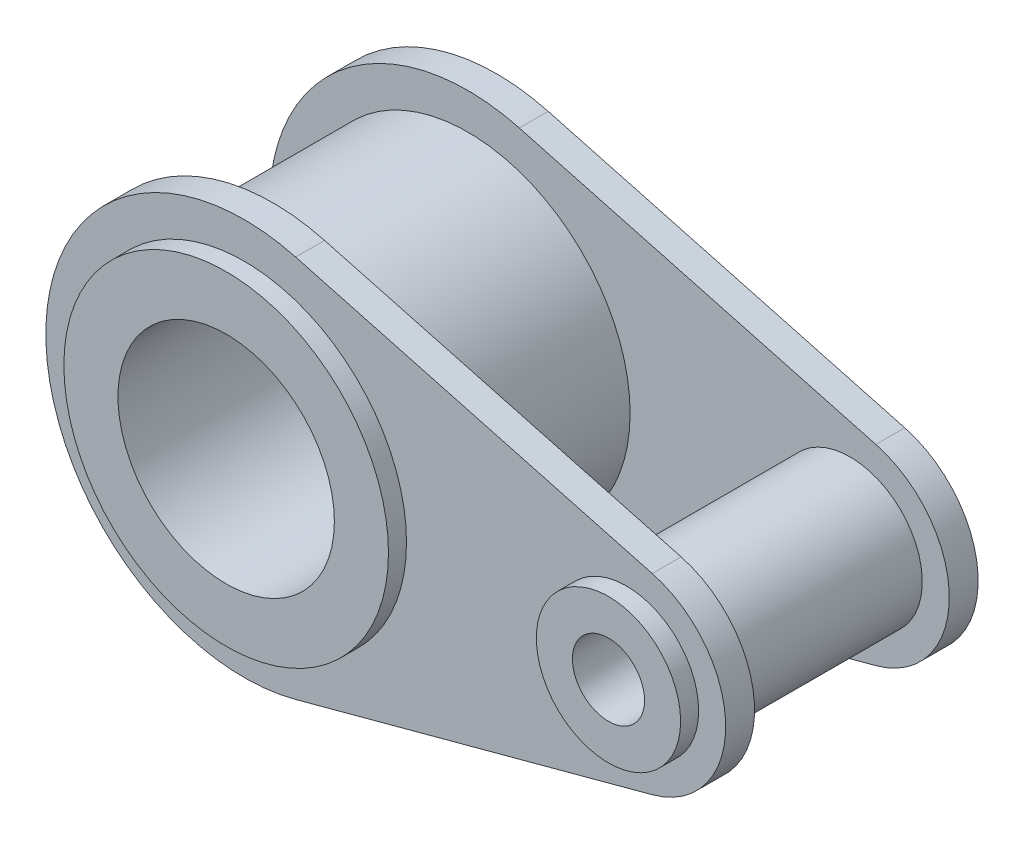
ISO-10303-21;
HEADER;
FILE_DESCRIPTION(('STEP AP214'),'2;1');
FILE_NAME('part.step','',(''),(''),'','','');
FILE_SCHEMA(('AUTOMOTIVE_DESIGN { 1 0 10303 214 1 1 1 1 }'));
ENDSEC;
DATA;
#1=APPLICATION_CONTEXT('core data for automotive mechanical design processes');
#2=APPLICATION_PROTOCOL_DEFINITION('international standard','automotive_design',2000,#1);
#3=PRODUCT_CONTEXT('',#1,'mechanical');
#4=PRODUCT('Part','Part','',(#3));
#5=PRODUCT_RELATED_PRODUCT_CATEGORY('part','',(#4));
#6=PRODUCT_DEFINITION_FORMATION('','',#4);
#7=PRODUCT_DEFINITION_CONTEXT('part definition',#1,'design');
#8=PRODUCT_DEFINITION('design','',#6,#7);
#9=PRODUCT_DEFINITION_SHAPE('','',#8);
#10=(LENGTH_UNIT() NAMED_UNIT(*) SI_UNIT(.MILLI.,.METRE.));
#11=(NAMED_UNIT(*) PLANE_ANGLE_UNIT() SI_UNIT($,.RADIAN.));
#12=(NAMED_UNIT(*) SI_UNIT($,.STERADIAN.) SOLID_ANGLE_UNIT());
#13=UNCERTAINTY_MEASURE_WITH_UNIT(LENGTH_MEASURE(1.E-05),#10,'distance_accuracy_value','');
#14=(GEOMETRIC_REPRESENTATION_CONTEXT(3) GLOBAL_UNCERTAINTY_ASSIGNED_CONTEXT((#13)) GLOBAL_UNIT_ASSIGNED_CONTEXT((#10,
#11,#12)) REPRESENTATION_CONTEXT('',''));
#15=CARTESIAN_POINT('',(0.,0.,0.));
#16=DIRECTION('',(0.,0.,1.));
#17=DIRECTION('',(1.,0.,0.));
#18=AXIS2_PLACEMENT_3D('',#15,#16,#17);
#19=CARTESIAN_POINT('',(0.,0.,40.));
#20=DIRECTION('',(0.,0.,-1.));
#21=DIRECTION('',(-1.,0.,0.));
#22=AXIS2_PLACEMENT_3D('',#19,#20,#21);
#23=CYLINDRICAL_SURFACE('',#22,45.);
#24=CARTESIAN_POINT('',(0.,0.,27.));
#25=DIRECTION('',(0.,0.,1.));
#26=DIRECTION('',(1.,0.,0.));
#27=AXIS2_PLACEMENT_3D('',#24,#25,#26);
#28=CIRCLE('',#27,45.);
#29=CARTESIAN_POINT('',(45.,0.,27.));
#30=VERTEX_POINT('',#29);
#31=EDGE_CURVE('E255',#30,#30,#28,.T.);
#32=ORIENTED_EDGE('',*,*,#31,.F.);
#33=EDGE_LOOP('',(#32));
#34=FACE_BOUND('',#33,.T.);
#35=CARTESIAN_POINT('',(0.,0.,-27.));
#36=DIRECTION('',(0.,0.,-1.));
#37=DIRECTION('',(-1.,0.,0.));
#38=AXIS2_PLACEMENT_3D('',#35,#36,#37);
#39=CIRCLE('',#38,45.);
#40=CARTESIAN_POINT('',(-45.,0.,-27.));
#41=VERTEX_POINT('',#40);
#42=EDGE_CURVE('E11',#41,#41,#39,.T.);
#43=ORIENTED_EDGE('',*,*,#42,.F.);
#44=EDGE_LOOP('',(#43));
#45=FACE_BOUND('',#44,.T.);
#46=ADVANCED_FACE('F43',(#34,#45),#23,.T.);
#47=CARTESIAN_POINT('',(106.,0.,40.));
#48=DIRECTION('',(0.,0.,-1.));
#49=DIRECTION('',(-1.,0.,0.));
#50=AXIS2_PLACEMENT_3D('',#47,#48,#49);
#51=CYLINDRICAL_SURFACE('',#50,20.);
#52=CARTESIAN_POINT('',(106.,0.,27.));
#53=DIRECTION('',(0.,0.,1.));
#54=DIRECTION('',(1.,0.,0.));
#55=AXIS2_PLACEMENT_3D('',#52,#53,#54);
#56=CIRCLE('',#55,20.);
#57=CARTESIAN_POINT('',(126.,0.,27.));
#58=VERTEX_POINT('',#57);
#59=EDGE_CURVE('E191',#58,#58,#56,.F.);
#60=ORIENTED_EDGE('',*,*,#59,.T.);
#61=EDGE_LOOP('',(#60));
#62=FACE_BOUND('',#61,.T.);
#63=CARTESIAN_POINT('',(106.,0.,-27.));
#64=DIRECTION('',(0.,0.,-1.));
#65=DIRECTION('',(-1.,0.,0.));
#66=AXIS2_PLACEMENT_3D('',#63,#64,#65);
#67=CIRCLE('',#66,20.);
#68=CARTESIAN_POINT('',(86.,0.,-27.));
#69=VERTEX_POINT('',#68);
#70=EDGE_CURVE('E53',#69,#69,#67,.T.);
#71=ORIENTED_EDGE('',*,*,#70,.F.);
#72=EDGE_LOOP('',(#71));
#73=FACE_BOUND('',#72,.T.);
#74=ADVANCED_FACE('F270',(#62,#73),#51,.T.);
#75=CARTESIAN_POINT('',(0.,0.,-35.));
#76=DIRECTION('',(0.,0.,1.));
#77=DIRECTION('',(1.,0.,0.));
#78=AXIS2_PLACEMENT_3D('',#75,#76,#77);
#79=CIRCLE('',#78,45.);
#80=CARTESIAN_POINT('',(45.,0.,-35.));
#81=VERTEX_POINT('',#80);
#82=EDGE_CURVE('E162',#81,#81,#79,.T.);
#83=ORIENTED_EDGE('',*,*,#82,.F.);
#84=EDGE_LOOP('',(#83));
#85=FACE_BOUND('',#84,.T.);
#86=CARTESIAN_POINT('',(0.,0.,-40.));
#87=DIRECTION('',(0.,0.,1.));
#88=DIRECTION('',(1.,0.,0.));
#89=AXIS2_PLACEMENT_3D('',#86,#87,#88);
#90=CIRCLE('',#89,45.);
#91=CARTESIAN_POINT('',(45.,0.,-40.));
#92=VERTEX_POINT('',#91);
#93=EDGE_CURVE('E238',#92,#92,#90,.T.);
#94=ORIENTED_EDGE('',*,*,#93,.T.);
#95=EDGE_LOOP('',(#94));
#96=FACE_BOUND('',#95,.T.);
#97=ADVANCED_FACE('F272',(#85,#96),#23,.T.);
#98=CARTESIAN_POINT('',(0.,0.,35.));
#99=DIRECTION('',(0.,0.,1.));
#100=DIRECTION('',(1.,0.,0.));
#101=AXIS2_PLACEMENT_3D('',#98,#99,#100);
#102=CIRCLE('',#101,45.);
#103=CARTESIAN_POINT('',(45.,0.,35.));
#104=VERTEX_POINT('',#103);
#105=EDGE_CURVE('E218',#104,#104,#102,.T.);
#106=ORIENTED_EDGE('',*,*,#105,.T.);
#107=EDGE_LOOP('',(#106));
#108=FACE_BOUND('',#107,.T.);
#109=CARTESIAN_POINT('',(0.,0.,40.));
#110=DIRECTION('',(0.,0.,1.));
#111=DIRECTION('',(1.,0.,0.));
#112=AXIS2_PLACEMENT_3D('',#109,#110,#111);
#113=CIRCLE('',#112,45.);
#114=CARTESIAN_POINT('',(45.,0.,40.));
#115=VERTEX_POINT('',#114);
#116=EDGE_CURVE('E246',#115,#115,#113,.T.);
#117=ORIENTED_EDGE('',*,*,#116,.F.);
#118=EDGE_LOOP('',(#117));
#119=FACE_BOUND('',#118,.T.);
#120=ADVANCED_FACE('F45',(#108,#119),#23,.T.);
#121=CARTESIAN_POINT('',(0.,0.,40.));
#122=DIRECTION('',(0.,0.,-1.));
#123=DIRECTION('',(-1.,0.,0.));
#124=AXIS2_PLACEMENT_3D('',#121,#122,#123);
#125=CYLINDRICAL_SURFACE('',#124,30.);
#126=CARTESIAN_POINT('',(0.,0.,40.));
#127=DIRECTION('',(0.,0.,1.));
#128=DIRECTION('',(1.,0.,0.));
#129=AXIS2_PLACEMENT_3D('',#126,#127,#128);
#130=CIRCLE('',#129,30.);
#131=CARTESIAN_POINT('',(30.,0.,40.));
#132=VERTEX_POINT('',#131);
#133=EDGE_CURVE('E250',#132,#132,#130,.T.);
#134=ORIENTED_EDGE('',*,*,#133,.T.);
#135=EDGE_LOOP('',(#134));
#136=FACE_BOUND('',#135,.T.);
#137=CARTESIAN_POINT('',(0.,0.,-40.));
#138=DIRECTION('',(0.,0.,1.));
#139=DIRECTION('',(1.,0.,0.));
#140=AXIS2_PLACEMENT_3D('',#137,#138,#139);
#141=CIRCLE('',#140,30.);
#142=CARTESIAN_POINT('',(30.,0.,-40.));
#143=VERTEX_POINT('',#142);
#144=EDGE_CURVE('E251',#143,#143,#141,.T.);
#145=ORIENTED_EDGE('',*,*,#144,.F.);
#146=EDGE_LOOP('',(#145));
#147=FACE_BOUND('',#146,.T.);
#148=ADVANCED_FACE('F338',(#136,#147),#125,.F.);
#149=CARTESIAN_POINT('',(0.,0.,40.));
#150=DIRECTION('',(0.,0.,1.));
#151=DIRECTION('',(1.,0.,0.));
#152=AXIS2_PLACEMENT_3D('',#149,#150,#151);
#153=PLANE('',#152);
#154=ORIENTED_EDGE('',*,*,#116,.T.);
#155=EDGE_LOOP('',(#154));
#156=FACE_BOUND('',#155,.T.);
#157=ORIENTED_EDGE('',*,*,#133,.F.);
#158=EDGE_LOOP('',(#157));
#159=FACE_BOUND('',#158,.T.);
#160=ADVANCED_FACE('F335',(#156,#159),#153,.T.);
#161=CARTESIAN_POINT('',(0.,0.,-40.));
#162=DIRECTION('',(0.,0.,1.));
#163=DIRECTION('',(1.,0.,0.));
#164=AXIS2_PLACEMENT_3D('',#161,#162,#163);
#165=PLANE('',#164);
#166=ORIENTED_EDGE('',*,*,#93,.F.);
#167=EDGE_LOOP('',(#166));
#168=FACE_BOUND('',#167,.T.);
#169=ORIENTED_EDGE('',*,*,#144,.T.);
#170=EDGE_LOOP('',(#169));
#171=FACE_BOUND('',#170,.T.);
#172=ADVANCED_FACE('F334',(#168,#171),#165,.F.);
#173=CARTESIAN_POINT('',(14.2688679245283,-53.1168467451934,27.));
#174=DIRECTION('',(0.259433962264151,-0.965760849912608,0.));
#175=DIRECTION('',(0.965760849912608,0.259433962264151,0.));
#176=AXIS2_PLACEMENT_3D('',#173,#174,#175);
#177=PLANE('',#176);
#178=DIRECTION('',(0.965760849912608,0.259433962264151,0.));
#179=VECTOR('',#178,1.);
#180=CARTESIAN_POINT('',(14.2688679245283,-53.1168467451934,35.));
#181=LINE('',#180,#179);
#182=CARTESIAN_POINT('',(14.2688679245283,-53.1168467451934,35.));
#183=VERTEX_POINT('',#182);
#184=CARTESIAN_POINT('',(113.134433962264,-26.5584233725967,35.));
#185=VERTEX_POINT('',#184);
#186=EDGE_CURVE('E222',#183,#185,#181,.T.);
#187=ORIENTED_EDGE('',*,*,#186,.F.);
#188=DIRECTION('',(0.,0.,1.));
#189=VECTOR('',#188,1.);
#190=CARTESIAN_POINT('',(14.2688679245283,-53.1168467451934,27.));
#191=LINE('',#190,#189);
#192=CARTESIAN_POINT('',(14.2688679245283,-53.1168467451934,27.));
#193=VERTEX_POINT('',#192);
#194=EDGE_CURVE('E61',#193,#183,#191,.T.);
#195=ORIENTED_EDGE('',*,*,#194,.F.);
#196=DIRECTION('',(0.965760849912608,0.259433962264151,0.));
#197=VECTOR('',#196,1.);
#198=CARTESIAN_POINT('',(14.2688679245283,-53.1168467451934,27.));
#199=LINE('',#198,#197);
#200=CARTESIAN_POINT('',(113.134433962264,-26.5584233725967,27.));
#201=VERTEX_POINT('',#200);
#202=EDGE_CURVE('E202',#193,#201,#199,.T.);
#203=ORIENTED_EDGE('',*,*,#202,.T.);
#204=DIRECTION('',(0.,0.,1.));
#205=VECTOR('',#204,1.);
#206=CARTESIAN_POINT('',(113.134433962264,-26.5584233725967,27.));
#207=LINE('',#206,#205);
#208=EDGE_CURVE('E90',#201,#185,#207,.T.);
#209=ORIENTED_EDGE('',*,*,#208,.T.);
#210=EDGE_LOOP('',(#187,#195,#203,#209));
#211=FACE_BOUND('',#210,.T.);
#212=ADVANCED_FACE('F311',(#211),#177,.T.);
#213=CARTESIAN_POINT('',(0.,0.,27.));
#214=DIRECTION('',(0.,0.,1.));
#215=DIRECTION('',(1.,0.,0.));
#216=AXIS2_PLACEMENT_3D('',#213,#214,#215);
#217=CYLINDRICAL_SURFACE('',#216,55.);
#218=CARTESIAN_POINT('',(0.,0.,35.));
#219=DIRECTION('',(0.,0.,1.));
#220=DIRECTION('',(1.,0.,0.));
#221=AXIS2_PLACEMENT_3D('',#218,#219,#220);
#222=CIRCLE('',#221,55.);
#223=CARTESIAN_POINT('',(14.2688679245283,53.1168467451934,35.));
#224=VERTEX_POINT('',#223);
#225=EDGE_CURVE('E206',#224,#183,#222,.T.);
#226=ORIENTED_EDGE('',*,*,#225,.F.);
#227=DIRECTION('',(0.,0.,1.));
#228=VECTOR('',#227,1.);
#229=CARTESIAN_POINT('',(14.2688679245283,53.1168467451934,27.));
#230=LINE('',#229,#228);
#231=CARTESIAN_POINT('',(14.2688679245283,53.1168467451934,27.));
#232=VERTEX_POINT('',#231);
#233=EDGE_CURVE('E79',#232,#224,#230,.T.);
#234=ORIENTED_EDGE('',*,*,#233,.F.);
#235=CARTESIAN_POINT('',(0.,0.,27.));
#236=DIRECTION('',(0.,0.,1.));
#237=DIRECTION('',(1.,0.,0.));
#238=AXIS2_PLACEMENT_3D('',#235,#236,#237);
#239=CIRCLE('',#238,55.);
#240=EDGE_CURVE('E212',#232,#193,#239,.T.);
#241=ORIENTED_EDGE('',*,*,#240,.T.);
#242=ORIENTED_EDGE('',*,*,#194,.T.);
#243=EDGE_LOOP('',(#226,#234,#241,#242));
#244=FACE_BOUND('',#243,.T.);
#245=ADVANCED_FACE('F315',(#244),#217,.T.);
#246=CARTESIAN_POINT('',(14.2688679245283,53.1168467451934,27.));
#247=DIRECTION('',(-0.259433962264151,-0.965760849912608,0.));
#248=DIRECTION('',(0.965760849912608,-0.259433962264151,0.));
#249=AXIS2_PLACEMENT_3D('',#246,#247,#248);
#250=PLANE('',#249);
#251=DIRECTION('',(0.965760849912608,-0.259433962264151,0.));
#252=VECTOR('',#251,1.);
#253=CARTESIAN_POINT('',(14.2688679245283,53.1168467451934,35.));
#254=LINE('',#253,#252);
#255=CARTESIAN_POINT('',(113.134433962264,26.5584233725967,35.));
#256=VERTEX_POINT('',#255);
#257=EDGE_CURVE('E230',#224,#256,#254,.T.);
#258=ORIENTED_EDGE('',*,*,#257,.T.);
#259=DIRECTION('',(0.,0.,1.));
#260=VECTOR('',#259,1.);
#261=CARTESIAN_POINT('',(113.134433962264,26.5584233725967,27.));
#262=LINE('',#261,#260);
#263=CARTESIAN_POINT('',(113.134433962264,26.5584233725967,27.));
#264=VERTEX_POINT('',#263);
#265=EDGE_CURVE('E241',#264,#256,#262,.T.);
#266=ORIENTED_EDGE('',*,*,#265,.F.);
#267=DIRECTION('',(0.965760849912608,-0.259433962264151,0.));
#268=VECTOR('',#267,1.);
#269=CARTESIAN_POINT('',(14.2688679245283,53.1168467451934,27.));
#270=LINE('',#269,#268);
#271=EDGE_CURVE('E209',#232,#264,#270,.T.);
#272=ORIENTED_EDGE('',*,*,#271,.F.);
#273=ORIENTED_EDGE('',*,*,#233,.T.);
#274=EDGE_LOOP('',(#258,#266,#272,#273));
#275=FACE_BOUND('',#274,.T.);
#276=ADVANCED_FACE('F314',(#275),#250,.F.);
#277=CARTESIAN_POINT('',(106.,0.,27.));
#278=DIRECTION('',(0.,0.,1.));
#279=DIRECTION('',(1.,0.,0.));
#280=AXIS2_PLACEMENT_3D('',#277,#278,#279);
#281=CYLINDRICAL_SURFACE('',#280,27.5);
#282=CARTESIAN_POINT('',(106.,0.,35.));
#283=DIRECTION('',(0.,0.,1.));
#284=DIRECTION('',(1.,0.,0.));
#285=AXIS2_PLACEMENT_3D('',#282,#283,#284);
#286=CIRCLE('',#285,27.5);
#287=EDGE_CURVE('E226',#185,#256,#286,.T.);
#288=ORIENTED_EDGE('',*,*,#287,.F.);
#289=ORIENTED_EDGE('',*,*,#208,.F.);
#290=CARTESIAN_POINT('',(106.,0.,27.));
#291=DIRECTION('',(0.,0.,1.));
#292=DIRECTION('',(1.,0.,0.));
#293=AXIS2_PLACEMENT_3D('',#290,#291,#292);
#294=CIRCLE('',#293,27.5);
#295=EDGE_CURVE('E205',#201,#264,#294,.T.);
#296=ORIENTED_EDGE('',*,*,#295,.T.);
#297=ORIENTED_EDGE('',*,*,#265,.T.);
#298=EDGE_LOOP('',(#288,#289,#296,#297));
#299=FACE_BOUND('',#298,.T.);
#300=ADVANCED_FACE('F312',(#299),#281,.T.);
#301=CARTESIAN_POINT('',(0.,0.,27.));
#302=DIRECTION('',(0.,0.,1.));
#303=DIRECTION('',(1.,0.,0.));
#304=AXIS2_PLACEMENT_3D('',#301,#302,#303);
#305=PLANE('',#304);
#306=ORIENTED_EDGE('',*,*,#59,.F.);
#307=EDGE_LOOP('',(#306));
#308=FACE_BOUND('',#307,.T.);
#309=ORIENTED_EDGE('',*,*,#31,.T.);
#310=EDGE_LOOP('',(#309));
#311=FACE_BOUND('',#310,.T.);
#312=ORIENTED_EDGE('',*,*,#202,.F.);
#313=ORIENTED_EDGE('',*,*,#240,.F.);
#314=ORIENTED_EDGE('',*,*,#271,.T.);
#315=ORIENTED_EDGE('',*,*,#295,.F.);
#316=EDGE_LOOP('',(#312,#313,#314,#315));
#317=FACE_BOUND('',#316,.T.);
#318=ADVANCED_FACE('F307',(#308,#311,#317),#305,.F.);
#319=CARTESIAN_POINT('',(0.,0.,35.));
#320=DIRECTION('',(0.,0.,1.));
#321=DIRECTION('',(1.,0.,0.));
#322=AXIS2_PLACEMENT_3D('',#319,#320,#321);
#323=PLANE('',#322);
#324=CARTESIAN_POINT('',(106.,0.,35.));
#325=DIRECTION('',(0.,0.,1.));
#326=DIRECTION('',(1.,0.,0.));
#327=AXIS2_PLACEMENT_3D('',#324,#325,#326);
#328=CIRCLE('',#327,20.);
#329=CARTESIAN_POINT('',(126.,0.,35.));
#330=VERTEX_POINT('',#329);
#331=EDGE_CURVE('E201',#330,#330,#328,.T.);
#332=ORIENTED_EDGE('',*,*,#331,.F.);
#333=EDGE_LOOP('',(#332));
#334=FACE_BOUND('',#333,.T.);
#335=ORIENTED_EDGE('',*,*,#105,.F.);
#336=EDGE_LOOP('',(#335));
#337=FACE_BOUND('',#336,.T.);
#338=ORIENTED_EDGE('',*,*,#186,.T.);
#339=ORIENTED_EDGE('',*,*,#287,.T.);
#340=ORIENTED_EDGE('',*,*,#257,.F.);
#341=ORIENTED_EDGE('',*,*,#225,.T.);
#342=EDGE_LOOP('',(#338,#339,#340,#341));
#343=FACE_BOUND('',#342,.T.);
#344=ADVANCED_FACE('F287',(#334,#337,#343),#323,.T.);
#345=CARTESIAN_POINT('',(106.,0.,-35.));
#346=DIRECTION('',(0.,0.,1.));
#347=DIRECTION('',(1.,0.,0.));
#348=AXIS2_PLACEMENT_3D('',#345,#346,#347);
#349=CIRCLE('',#348,20.);
#350=CARTESIAN_POINT('',(126.,0.,-35.));
#351=VERTEX_POINT('',#350);
#352=EDGE_CURVE('E158',#351,#351,#349,.T.);
#353=ORIENTED_EDGE('',*,*,#352,.F.);
#354=EDGE_LOOP('',(#353));
#355=FACE_BOUND('',#354,.T.);
#356=CARTESIAN_POINT('',(106.,0.,-40.));
#357=DIRECTION('',(0.,0.,1.));
#358=DIRECTION('',(1.,0.,0.));
#359=AXIS2_PLACEMENT_3D('',#356,#357,#358);
#360=CIRCLE('',#359,20.);
#361=CARTESIAN_POINT('',(126.,0.,-40.));
#362=VERTEX_POINT('',#361);
#363=EDGE_CURVE('E187',#362,#362,#360,.T.);
#364=ORIENTED_EDGE('',*,*,#363,.T.);
#365=EDGE_LOOP('',(#364));
#366=FACE_BOUND('',#365,.T.);
#367=ADVANCED_FACE('F275',(#355,#366),#51,.T.);
#368=CARTESIAN_POINT('',(106.,0.,40.));
#369=DIRECTION('',(0.,0.,-1.));
#370=DIRECTION('',(-1.,0.,0.));
#371=AXIS2_PLACEMENT_3D('',#368,#369,#370);
#372=CYLINDRICAL_SURFACE('',#371,9.99999999999999);
#373=CARTESIAN_POINT('',(106.,0.,40.));
#374=DIRECTION('',(0.,0.,1.));
#375=DIRECTION('',(1.,0.,0.));
#376=AXIS2_PLACEMENT_3D('',#373,#374,#375);
#377=CIRCLE('',#376,9.99999999999999);
#378=CARTESIAN_POINT('',(116.,0.,40.));
#379=VERTEX_POINT('',#378);
#380=EDGE_CURVE('E182',#379,#379,#377,.T.);
#381=ORIENTED_EDGE('',*,*,#380,.T.);
#382=EDGE_LOOP('',(#381));
#383=FACE_BOUND('',#382,.T.);
#384=CARTESIAN_POINT('',(106.,0.,-40.));
#385=DIRECTION('',(0.,0.,1.));
#386=DIRECTION('',(1.,0.,0.));
#387=AXIS2_PLACEMENT_3D('',#384,#385,#386);
#388=CIRCLE('',#387,9.99999999999999);
#389=CARTESIAN_POINT('',(116.,0.,-40.));
#390=VERTEX_POINT('',#389);
#391=EDGE_CURVE('E176',#390,#390,#388,.T.);
#392=ORIENTED_EDGE('',*,*,#391,.F.);
#393=EDGE_LOOP('',(#392));
#394=FACE_BOUND('',#393,.T.);
#395=ADVANCED_FACE('F286',(#383,#394),#372,.F.);
#396=ORIENTED_EDGE('',*,*,#331,.T.);
#397=EDGE_LOOP('',(#396));
#398=FACE_BOUND('',#397,.T.);
#399=CARTESIAN_POINT('',(106.,0.,40.));
#400=DIRECTION('',(0.,0.,1.));
#401=DIRECTION('',(1.,0.,0.));
#402=AXIS2_PLACEMENT_3D('',#399,#400,#401);
#403=CIRCLE('',#402,20.);
#404=CARTESIAN_POINT('',(126.,0.,40.));
#405=VERTEX_POINT('',#404);
#406=EDGE_CURVE('E186',#405,#405,#403,.T.);
#407=ORIENTED_EDGE('',*,*,#406,.F.);
#408=EDGE_LOOP('',(#407));
#409=FACE_BOUND('',#408,.T.);
#410=ADVANCED_FACE('F276',(#398,#409),#51,.T.);
#411=CARTESIAN_POINT('',(0.,0.,40.));
#412=DIRECTION('',(0.,0.,1.));
#413=DIRECTION('',(1.,0.,0.));
#414=AXIS2_PLACEMENT_3D('',#411,#412,#413);
#415=PLANE('',#414);
#416=ORIENTED_EDGE('',*,*,#380,.F.);
#417=EDGE_LOOP('',(#416));
#418=FACE_BOUND('',#417,.T.);
#419=ORIENTED_EDGE('',*,*,#406,.T.);
#420=EDGE_LOOP('',(#419));
#421=FACE_BOUND('',#420,.T.);
#422=ADVANCED_FACE('F290',(#418,#421),#415,.T.);
#423=CARTESIAN_POINT('',(0.,0.,-40.));
#424=DIRECTION('',(0.,0.,1.));
#425=DIRECTION('',(1.,0.,0.));
#426=AXIS2_PLACEMENT_3D('',#423,#424,#425);
#427=PLANE('',#426);
#428=ORIENTED_EDGE('',*,*,#391,.T.);
#429=EDGE_LOOP('',(#428));
#430=FACE_BOUND('',#429,.T.);
#431=ORIENTED_EDGE('',*,*,#363,.F.);
#432=EDGE_LOOP('',(#431));
#433=FACE_BOUND('',#432,.T.);
#434=ADVANCED_FACE('F296',(#430,#433),#427,.F.);
#435=CARTESIAN_POINT('',(14.2688679245283,-53.1168467451934,-27.));
#436=DIRECTION('',(-0.259433962264151,0.965760849912608,0.));
#437=DIRECTION('',(-0.965760849912608,-0.259433962264151,0.));
#438=AXIS2_PLACEMENT_3D('',#435,#436,#437);
#439=PLANE('',#438);
#440=DIRECTION('',(0.965760849912608,0.259433962264151,0.));
#441=VECTOR('',#440,1.);
#442=CARTESIAN_POINT('',(14.2688679245283,-53.1168467451934,-35.));
#443=LINE('',#442,#441);
#444=CARTESIAN_POINT('',(14.2688679245283,-53.1168467451934,-35.));
#445=VERTEX_POINT('',#444);
#446=CARTESIAN_POINT('',(113.134433962264,-26.5584233725967,-35.));
#447=VERTEX_POINT('',#446);
#448=EDGE_CURVE('E166',#445,#447,#443,.T.);
#449=ORIENTED_EDGE('',*,*,#448,.T.);
#450=DIRECTION('',(0.,0.,-1.));
#451=VECTOR('',#450,1.);
#452=CARTESIAN_POINT('',(113.134433962264,-26.5584233725967,-27.));
#453=LINE('',#452,#451);
#454=CARTESIAN_POINT('',(113.134433962264,-26.5584233725967,-27.));
#455=VERTEX_POINT('',#454);
#456=EDGE_CURVE('E145',#455,#447,#453,.T.);
#457=ORIENTED_EDGE('',*,*,#456,.F.);
#458=DIRECTION('',(0.965760849912608,0.259433962264151,0.));
#459=VECTOR('',#458,1.);
#460=CARTESIAN_POINT('',(14.2688679245283,-53.1168467451934,-27.));
#461=LINE('',#460,#459);
#462=CARTESIAN_POINT('',(14.2688679245283,-53.1168467451934,-27.));
#463=VERTEX_POINT('',#462);
#464=EDGE_CURVE('E124',#463,#455,#461,.T.);
#465=ORIENTED_EDGE('',*,*,#464,.F.);
#466=DIRECTION('',(0.,0.,-1.));
#467=VECTOR('',#466,1.);
#468=CARTESIAN_POINT('',(14.2688679245283,-53.1168467451934,-27.));
#469=LINE('',#468,#467);
#470=EDGE_CURVE('E132',#463,#445,#469,.T.);
#471=ORIENTED_EDGE('',*,*,#470,.T.);
#472=EDGE_LOOP('',(#449,#457,#465,#471));
#473=FACE_BOUND('',#472,.T.);
#474=ADVANCED_FACE('F143',(#473),#439,.F.);
#475=CARTESIAN_POINT('',(106.,0.,-27.));
#476=DIRECTION('',(0.,0.,-1.));
#477=DIRECTION('',(-1.,0.,0.));
#478=AXIS2_PLACEMENT_3D('',#475,#476,#477);
#479=CYLINDRICAL_SURFACE('',#478,27.5);
#480=CARTESIAN_POINT('',(106.,0.,-35.));
#481=DIRECTION('',(0.,0.,1.));
#482=DIRECTION('',(1.,0.,0.));
#483=AXIS2_PLACEMENT_3D('',#480,#481,#482);
#484=CIRCLE('',#483,27.5);
#485=CARTESIAN_POINT('',(113.134433962264,26.5584233725967,-35.));
#486=VERTEX_POINT('',#485);
#487=EDGE_CURVE('E147',#447,#486,#484,.T.);
#488=ORIENTED_EDGE('',*,*,#487,.T.);
#489=DIRECTION('',(0.,0.,-1.));
#490=VECTOR('',#489,1.);
#491=CARTESIAN_POINT('',(113.134433962264,26.5584233725967,-27.));
#492=LINE('',#491,#490);
#493=CARTESIAN_POINT('',(113.134433962264,26.5584233725967,-27.));
#494=VERTEX_POINT('',#493);
#495=EDGE_CURVE('E177',#494,#486,#492,.T.);
#496=ORIENTED_EDGE('',*,*,#495,.F.);
#497=CARTESIAN_POINT('',(106.,0.,-27.));
#498=DIRECTION('',(0.,0.,1.));
#499=DIRECTION('',(1.,0.,0.));
#500=AXIS2_PLACEMENT_3D('',#497,#498,#499);
#501=CIRCLE('',#500,27.5);
#502=EDGE_CURVE('E141',#455,#494,#501,.T.);
#503=ORIENTED_EDGE('',*,*,#502,.F.);
#504=ORIENTED_EDGE('',*,*,#456,.T.);
#505=EDGE_LOOP('',(#488,#496,#503,#504));
#506=FACE_BOUND('',#505,.T.);
#507=ADVANCED_FACE('F383',(#506),#479,.T.);
#508=CARTESIAN_POINT('',(14.2688679245283,53.1168467451934,-27.));
#509=DIRECTION('',(0.259433962264151,0.965760849912608,0.));
#510=DIRECTION('',(-0.965760849912608,0.259433962264151,0.));
#511=AXIS2_PLACEMENT_3D('',#508,#509,#510);
#512=PLANE('',#511);
#513=DIRECTION('',(0.965760849912608,-0.259433962264151,0.));
#514=VECTOR('',#513,1.);
#515=CARTESIAN_POINT('',(14.2688679245283,53.1168467451934,-35.));
#516=LINE('',#515,#514);
#517=CARTESIAN_POINT('',(14.2688679245283,53.1168467451934,-35.));
#518=VERTEX_POINT('',#517);
#519=EDGE_CURVE('E151',#518,#486,#516,.T.);
#520=ORIENTED_EDGE('',*,*,#519,.F.);
#521=DIRECTION('',(0.,0.,-1.));
#522=VECTOR('',#521,1.);
#523=CARTESIAN_POINT('',(14.2688679245283,53.1168467451934,-27.));
#524=LINE('',#523,#522);
#525=CARTESIAN_POINT('',(14.2688679245283,53.1168467451934,-27.));
#526=VERTEX_POINT('',#525);
#527=EDGE_CURVE('E140',#526,#518,#524,.T.);
#528=ORIENTED_EDGE('',*,*,#527,.F.);
#529=DIRECTION('',(0.965760849912608,-0.259433962264151,0.));
#530=VECTOR('',#529,1.);
#531=CARTESIAN_POINT('',(14.2688679245283,53.1168467451934,-27.));
#532=LINE('',#531,#530);
#533=EDGE_CURVE('E127',#526,#494,#532,.T.);
#534=ORIENTED_EDGE('',*,*,#533,.T.);
#535=ORIENTED_EDGE('',*,*,#495,.T.);
#536=EDGE_LOOP('',(#520,#528,#534,#535));
#537=FACE_BOUND('',#536,.T.);
#538=ADVANCED_FACE('F394',(#537),#512,.T.);
#539=CARTESIAN_POINT('',(0.,0.,-27.));
#540=DIRECTION('',(0.,0.,-1.));
#541=DIRECTION('',(-1.,0.,0.));
#542=AXIS2_PLACEMENT_3D('',#539,#540,#541);
#543=CYLINDRICAL_SURFACE('',#542,55.);
#544=CARTESIAN_POINT('',(0.,0.,-35.));
#545=DIRECTION('',(0.,0.,1.));
#546=DIRECTION('',(1.,0.,0.));
#547=AXIS2_PLACEMENT_3D('',#544,#545,#546);
#548=CIRCLE('',#547,55.);
#549=EDGE_CURVE('E135',#518,#445,#548,.T.);
#550=ORIENTED_EDGE('',*,*,#549,.T.);
#551=ORIENTED_EDGE('',*,*,#470,.F.);
#552=CARTESIAN_POINT('',(0.,0.,-27.));
#553=DIRECTION('',(0.,0.,1.));
#554=DIRECTION('',(1.,0.,0.));
#555=AXIS2_PLACEMENT_3D('',#552,#553,#554);
#556=CIRCLE('',#555,55.);
#557=EDGE_CURVE('E120',#526,#463,#556,.T.);
#558=ORIENTED_EDGE('',*,*,#557,.F.);
#559=ORIENTED_EDGE('',*,*,#527,.T.);
#560=EDGE_LOOP('',(#550,#551,#558,#559));
#561=FACE_BOUND('',#560,.T.);
#562=ADVANCED_FACE('F133',(#561),#543,.T.);
#563=CARTESIAN_POINT('',(0.,0.,-27.));
#564=DIRECTION('',(0.,0.,-1.));
#565=DIRECTION('',(1.,0.,0.));
#566=AXIS2_PLACEMENT_3D('',#563,#564,#565);
#567=PLANE('',#566);
#568=ORIENTED_EDGE('',*,*,#70,.T.);
#569=EDGE_LOOP('',(#568));
#570=FACE_BOUND('',#569,.T.);
#571=ORIENTED_EDGE('',*,*,#42,.T.);
#572=EDGE_LOOP('',(#571));
#573=FACE_BOUND('',#572,.T.);
#574=ORIENTED_EDGE('',*,*,#464,.T.);
#575=ORIENTED_EDGE('',*,*,#502,.T.);
#576=ORIENTED_EDGE('',*,*,#533,.F.);
#577=ORIENTED_EDGE('',*,*,#557,.T.);
#578=EDGE_LOOP('',(#574,#575,#576,#577));
#579=FACE_BOUND('',#578,.T.);
#580=ADVANCED_FACE('F122',(#570,#573,#579),#567,.F.);
#581=CARTESIAN_POINT('',(0.,0.,-35.));
#582=DIRECTION('',(0.,0.,-1.));
#583=DIRECTION('',(1.,0.,0.));
#584=AXIS2_PLACEMENT_3D('',#581,#582,#583);
#585=PLANE('',#584);
#586=ORIENTED_EDGE('',*,*,#352,.T.);
#587=EDGE_LOOP('',(#586));
#588=FACE_BOUND('',#587,.T.);
#589=ORIENTED_EDGE('',*,*,#82,.T.);
#590=EDGE_LOOP('',(#589));
#591=FACE_BOUND('',#590,.T.);
#592=ORIENTED_EDGE('',*,*,#448,.F.);
#593=ORIENTED_EDGE('',*,*,#549,.F.);
#594=ORIENTED_EDGE('',*,*,#519,.T.);
#595=ORIENTED_EDGE('',*,*,#487,.F.);
#596=EDGE_LOOP('',(#592,#593,#594,#595));
#597=FACE_BOUND('',#596,.T.);
#598=ADVANCED_FACE('F421',(#588,#591,#597),#585,.T.);
#599=CLOSED_SHELL('',(#46,#74,#97,#120,#148,#160,#172,#212,#245,#276,#300,#318,#344,#367,#395,
#410,#422,#434,#474,#507,#538,#562,#580,#598));
#600=MANIFOLD_SOLID_BREP('B2',#599);
#601=ADVANCED_BREP_SHAPE_REPRESENTATION('',(#18,#600),#14);
#602=SHAPE_DEFINITION_REPRESENTATION(#9,#601);
ENDSEC;
END-ISO-10303-21;
